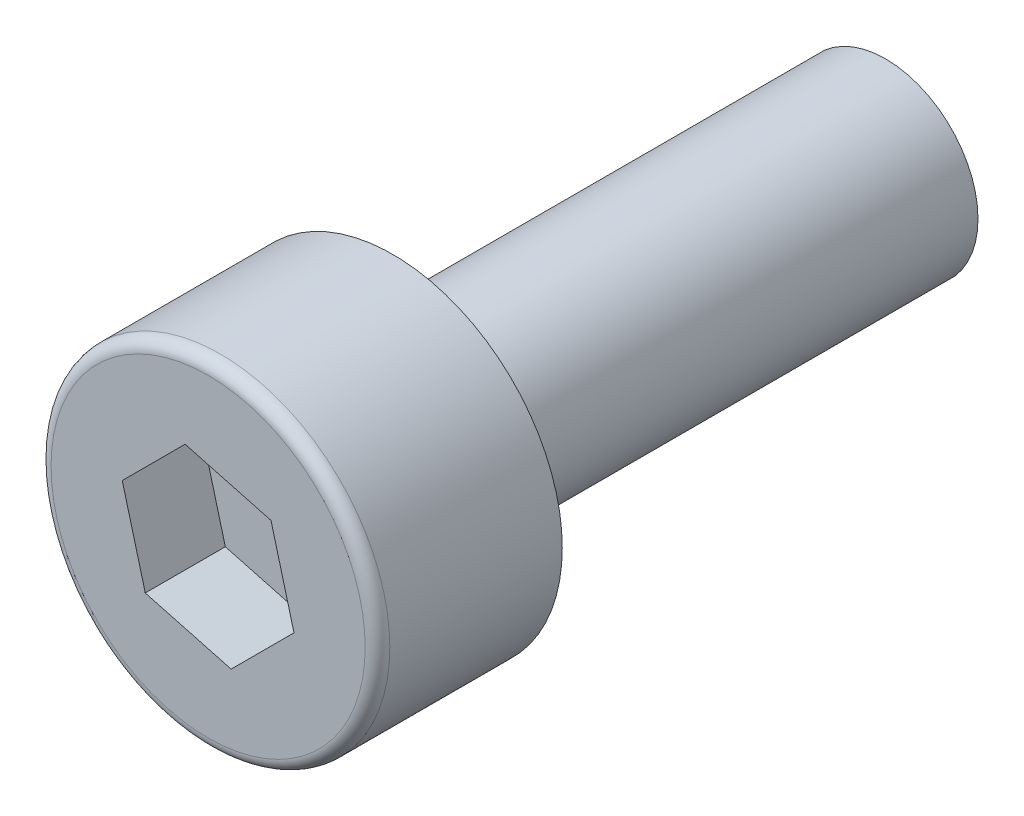
ISO-10303-21;
HEADER;
FILE_DESCRIPTION(('STEP AP214'),'2;1');
FILE_NAME('part.step','',(''),(''),'','','');
FILE_SCHEMA(('AUTOMOTIVE_DESIGN { 1 0 10303 214 1 1 1 1 }'));
ENDSEC;
DATA;
#1=APPLICATION_CONTEXT('core data for automotive mechanical design processes');
#2=APPLICATION_PROTOCOL_DEFINITION('international standard','automotive_design',2000,#1);
#3=PRODUCT_CONTEXT('',#1,'mechanical');
#4=PRODUCT('Part','Part','',(#3));
#5=PRODUCT_RELATED_PRODUCT_CATEGORY('part','',(#4));
#6=PRODUCT_DEFINITION_FORMATION('','',#4);
#7=PRODUCT_DEFINITION_CONTEXT('part definition',#1,'design');
#8=PRODUCT_DEFINITION('design','',#6,#7);
#9=PRODUCT_DEFINITION_SHAPE('','',#8);
#10=(LENGTH_UNIT() NAMED_UNIT(*) SI_UNIT(.MILLI.,.METRE.));
#11=(NAMED_UNIT(*) PLANE_ANGLE_UNIT() SI_UNIT($,.RADIAN.));
#12=(NAMED_UNIT(*) SI_UNIT($,.STERADIAN.) SOLID_ANGLE_UNIT());
#13=UNCERTAINTY_MEASURE_WITH_UNIT(LENGTH_MEASURE(1.E-05),#10,'distance_accuracy_value','');
#14=(GEOMETRIC_REPRESENTATION_CONTEXT(3) GLOBAL_UNCERTAINTY_ASSIGNED_CONTEXT((#13)) GLOBAL_UNIT_ASSIGNED_CONTEXT((#10,
#11,#12)) REPRESENTATION_CONTEXT('',''));
#15=CARTESIAN_POINT('',(0.,0.,0.));
#16=DIRECTION('',(0.,0.,1.));
#17=DIRECTION('',(1.,0.,0.));
#18=AXIS2_PLACEMENT_3D('',#15,#16,#17);
#19=CARTESIAN_POINT('',(0.,0.,0.));
#20=DIRECTION('',(0.,0.,1.));
#21=DIRECTION('',(1.,0.,0.));
#22=AXIS2_PLACEMENT_3D('',#19,#20,#21);
#23=PLANE('',#22);
#24=CARTESIAN_POINT('',(0.,0.,0.));
#25=DIRECTION('',(0.,0.,1.));
#26=DIRECTION('',(1.,0.,0.));
#27=AXIS2_PLACEMENT_3D('',#24,#25,#26);
#28=CIRCLE('',#27,2.75);
#29=CARTESIAN_POINT('',(2.75,0.,0.));
#30=VERTEX_POINT('',#29);
#31=EDGE_CURVE('E137',#30,#30,#28,.T.);
#32=ORIENTED_EDGE('',*,*,#31,.F.);
#33=EDGE_LOOP('',(#32));
#34=FACE_BOUND('',#33,.T.);
#35=CARTESIAN_POINT('',(0.,0.,0.));
#36=DIRECTION('',(0.,0.,1.));
#37=DIRECTION('',(1.,0.,0.));
#38=AXIS2_PLACEMENT_3D('',#35,#36,#37);
#39=CIRCLE('',#38,1.5);
#40=CARTESIAN_POINT('',(1.5,0.,0.));
#41=VERTEX_POINT('',#40);
#42=EDGE_CURVE('E145',#41,#41,#39,.F.);
#43=ORIENTED_EDGE('',*,*,#42,.F.);
#44=EDGE_LOOP('',(#43));
#45=FACE_BOUND('',#44,.T.);
#46=ADVANCED_FACE('F34',(#34,#45),#23,.F.);
#47=CARTESIAN_POINT('',(0.,0.,3.));
#48=DIRECTION('',(0.,0.,-1.));
#49=DIRECTION('',(-1.,0.,0.));
#50=AXIS2_PLACEMENT_3D('',#47,#48,#49);
#51=CYLINDRICAL_SURFACE('',#50,2.75);
#52=CARTESIAN_POINT('',(0.,0.,2.8));
#53=DIRECTION('',(0.,0.,1.));
#54=DIRECTION('',(1.,0.,0.));
#55=AXIS2_PLACEMENT_3D('',#52,#53,#54);
#56=CIRCLE('',#55,2.75);
#57=CARTESIAN_POINT('',(2.75,0.,2.8));
#58=VERTEX_POINT('',#57);
#59=EDGE_CURVE('E11',#58,#58,#56,.F.);
#60=ORIENTED_EDGE('',*,*,#59,.T.);
#61=EDGE_LOOP('',(#60));
#62=FACE_BOUND('',#61,.T.);
#63=ORIENTED_EDGE('',*,*,#31,.T.);
#64=EDGE_LOOP('',(#63));
#65=FACE_BOUND('',#64,.T.);
#66=ADVANCED_FACE('F164',(#62,#65),#51,.T.);
#67=CARTESIAN_POINT('',(0.,0.,3.));
#68=DIRECTION('',(0.,0.,1.));
#69=DIRECTION('',(1.,0.,0.));
#70=AXIS2_PLACEMENT_3D('',#67,#68,#69);
#71=PLANE('',#70);
#72=CARTESIAN_POINT('',(0.,0.,3.));
#73=DIRECTION('',(0.,0.,1.));
#74=DIRECTION('',(1.,0.,0.));
#75=AXIS2_PLACEMENT_3D('',#72,#73,#74);
#76=CIRCLE('',#75,2.55);
#77=CARTESIAN_POINT('',(2.55,0.,3.));
#78=VERTEX_POINT('',#77);
#79=EDGE_CURVE('E42',#78,#78,#76,.T.);
#80=ORIENTED_EDGE('',*,*,#79,.T.);
#81=EDGE_LOOP('',(#80));
#82=FACE_BOUND('',#81,.T.);
#83=DIRECTION('',(0.258819045102521,-0.965925826289068,0.));
#84=VECTOR('',#83,1.);
#85=CARTESIAN_POINT('',(-1.39419383956301,0.373573113403356,3.));
#86=LINE('',#85,#84);
#87=CARTESIAN_POINT('',(-1.39419383956301,0.373573113403356,3.));
#88=VERTEX_POINT('',#87);
#89=CARTESIAN_POINT('',(-1.02062072615966,-1.02062072615966,3.));
#90=VERTEX_POINT('',#89);
#91=EDGE_CURVE('E49',#88,#90,#86,.T.);
#92=ORIENTED_EDGE('',*,*,#91,.F.);
#93=DIRECTION('',(-0.707106781186548,-0.707106781186548,0.));
#94=VECTOR('',#93,1.);
#95=CARTESIAN_POINT('',(-0.373573113403355,1.39419383956301,3.));
#96=LINE('',#95,#94);
#97=CARTESIAN_POINT('',(-0.373573113403355,1.39419383956301,3.));
#98=VERTEX_POINT('',#97);
#99=EDGE_CURVE('E133',#98,#88,#96,.T.);
#100=ORIENTED_EDGE('',*,*,#99,.F.);
#101=DIRECTION('',(-0.965925826289068,0.258819045102521,0.));
#102=VECTOR('',#101,1.);
#103=CARTESIAN_POINT('',(1.02062072615966,1.02062072615966,3.));
#104=LINE('',#103,#102);
#105=CARTESIAN_POINT('',(1.02062072615966,1.02062072615966,3.));
#106=VERTEX_POINT('',#105);
#107=EDGE_CURVE('E131',#106,#98,#104,.T.);
#108=ORIENTED_EDGE('',*,*,#107,.F.);
#109=DIRECTION('',(-0.258819045102521,0.965925826289068,0.));
#110=VECTOR('',#109,1.);
#111=CARTESIAN_POINT('',(1.39419383956301,-0.373573113403355,3.));
#112=LINE('',#111,#110);
#113=CARTESIAN_POINT('',(1.39419383956301,-0.373573113403355,3.));
#114=VERTEX_POINT('',#113);
#115=EDGE_CURVE('E97',#114,#106,#112,.T.);
#116=ORIENTED_EDGE('',*,*,#115,.F.);
#117=DIRECTION('',(0.707106781186548,0.707106781186548,0.));
#118=VECTOR('',#117,1.);
#119=CARTESIAN_POINT('',(0.373573113403355,-1.39419383956301,3.));
#120=LINE('',#119,#118);
#121=CARTESIAN_POINT('',(0.373573113403355,-1.39419383956301,3.));
#122=VERTEX_POINT('',#121);
#123=EDGE_CURVE('E127',#122,#114,#120,.T.);
#124=ORIENTED_EDGE('',*,*,#123,.F.);
#125=DIRECTION('',(0.965925826289068,-0.258819045102521,0.));
#126=VECTOR('',#125,1.);
#127=CARTESIAN_POINT('',(-1.02062072615966,-1.02062072615966,3.));
#128=LINE('',#127,#126);
#129=EDGE_CURVE('E123',#90,#122,#128,.T.);
#130=ORIENTED_EDGE('',*,*,#129,.F.);
#131=EDGE_LOOP('',(#92,#100,#108,#116,#124,#130));
#132=FACE_BOUND('',#131,.T.);
#133=ADVANCED_FACE('F150',(#82,#132),#71,.T.);
#134=CARTESIAN_POINT('',(-1.39419383956301,0.373573113403356,1.7));
#135=DIRECTION('',(-0.965925826289068,-0.258819045102521,0.));
#136=DIRECTION('',(0.258819045102521,-0.965925826289068,0.));
#137=AXIS2_PLACEMENT_3D('',#134,#135,#136);
#138=PLANE('',#137);
#139=ORIENTED_EDGE('',*,*,#91,.T.);
#140=DIRECTION('',(0.,0.,1.));
#141=VECTOR('',#140,1.);
#142=CARTESIAN_POINT('',(-1.02062072615966,-1.02062072615966,1.7));
#143=LINE('',#142,#141);
#144=CARTESIAN_POINT('',(-1.02062072615966,-1.02062072615966,1.7));
#145=VERTEX_POINT('',#144);
#146=EDGE_CURVE('E79',#145,#90,#143,.T.);
#147=ORIENTED_EDGE('',*,*,#146,.F.);
#148=DIRECTION('',(0.258819045102521,-0.965925826289068,0.));
#149=VECTOR('',#148,1.);
#150=CARTESIAN_POINT('',(-1.39419383956301,0.373573113403356,1.7));
#151=LINE('',#150,#149);
#152=CARTESIAN_POINT('',(-1.39419383956301,0.373573113403356,1.7));
#153=VERTEX_POINT('',#152);
#154=EDGE_CURVE('E135',#153,#145,#151,.T.);
#155=ORIENTED_EDGE('',*,*,#154,.F.);
#156=DIRECTION('',(0.,0.,1.));
#157=VECTOR('',#156,1.);
#158=CARTESIAN_POINT('',(-1.39419383956301,0.373573113403356,1.7));
#159=LINE('',#158,#157);
#160=EDGE_CURVE('E57',#153,#88,#159,.T.);
#161=ORIENTED_EDGE('',*,*,#160,.T.);
#162=EDGE_LOOP('',(#139,#147,#155,#161));
#163=FACE_BOUND('',#162,.T.);
#164=ADVANCED_FACE('F176',(#163),#138,.F.);
#165=CARTESIAN_POINT('',(-0.373573113403355,1.39419383956301,1.7));
#166=DIRECTION('',(-0.707106781186548,0.707106781186548,0.));
#167=DIRECTION('',(-0.707106781186548,-0.707106781186548,0.));
#168=AXIS2_PLACEMENT_3D('',#165,#166,#167);
#169=PLANE('',#168);
#170=ORIENTED_EDGE('',*,*,#99,.T.);
#171=ORIENTED_EDGE('',*,*,#160,.F.);
#172=DIRECTION('',(-0.707106781186548,-0.707106781186548,0.));
#173=VECTOR('',#172,1.);
#174=CARTESIAN_POINT('',(-0.373573113403355,1.39419383956301,1.7));
#175=LINE('',#174,#173);
#176=CARTESIAN_POINT('',(-0.373573113403355,1.39419383956301,1.7));
#177=VERTEX_POINT('',#176);
#178=EDGE_CURVE('E109',#177,#153,#175,.T.);
#179=ORIENTED_EDGE('',*,*,#178,.F.);
#180=DIRECTION('',(0.,0.,1.));
#181=VECTOR('',#180,1.);
#182=CARTESIAN_POINT('',(-0.373573113403355,1.39419383956301,1.7));
#183=LINE('',#182,#181);
#184=EDGE_CURVE('E101',#177,#98,#183,.T.);
#185=ORIENTED_EDGE('',*,*,#184,.T.);
#186=EDGE_LOOP('',(#170,#171,#179,#185));
#187=FACE_BOUND('',#186,.T.);
#188=ADVANCED_FACE('F179',(#187),#169,.F.);
#189=CARTESIAN_POINT('',(1.02062072615966,1.02062072615966,1.7));
#190=DIRECTION('',(0.258819045102521,0.965925826289068,0.));
#191=DIRECTION('',(-0.965925826289068,0.258819045102521,0.));
#192=AXIS2_PLACEMENT_3D('',#189,#190,#191);
#193=PLANE('',#192);
#194=ORIENTED_EDGE('',*,*,#107,.T.);
#195=ORIENTED_EDGE('',*,*,#184,.F.);
#196=DIRECTION('',(-0.965925826289068,0.258819045102521,0.));
#197=VECTOR('',#196,1.);
#198=CARTESIAN_POINT('',(1.02062072615966,1.02062072615966,1.7));
#199=LINE('',#198,#197);
#200=CARTESIAN_POINT('',(1.02062072615966,1.02062072615966,1.7));
#201=VERTEX_POINT('',#200);
#202=EDGE_CURVE('E105',#201,#177,#199,.T.);
#203=ORIENTED_EDGE('',*,*,#202,.F.);
#204=DIRECTION('',(0.,0.,1.));
#205=VECTOR('',#204,1.);
#206=CARTESIAN_POINT('',(1.02062072615966,1.02062072615966,1.7));
#207=LINE('',#206,#205);
#208=EDGE_CURVE('E90',#201,#106,#207,.T.);
#209=ORIENTED_EDGE('',*,*,#208,.T.);
#210=EDGE_LOOP('',(#194,#195,#203,#209));
#211=FACE_BOUND('',#210,.T.);
#212=ADVANCED_FACE('F106',(#211),#193,.F.);
#213=CARTESIAN_POINT('',(1.39419383956301,-0.373573113403355,1.7));
#214=DIRECTION('',(0.965925826289068,0.258819045102521,0.));
#215=DIRECTION('',(-0.258819045102521,0.965925826289068,0.));
#216=AXIS2_PLACEMENT_3D('',#213,#214,#215);
#217=PLANE('',#216);
#218=ORIENTED_EDGE('',*,*,#115,.T.);
#219=ORIENTED_EDGE('',*,*,#208,.F.);
#220=DIRECTION('',(-0.258819045102521,0.965925826289068,0.));
#221=VECTOR('',#220,1.);
#222=CARTESIAN_POINT('',(1.39419383956301,-0.373573113403355,1.7));
#223=LINE('',#222,#221);
#224=CARTESIAN_POINT('',(1.39419383956301,-0.373573113403355,1.7));
#225=VERTEX_POINT('',#224);
#226=EDGE_CURVE('E94',#225,#201,#223,.T.);
#227=ORIENTED_EDGE('',*,*,#226,.F.);
#228=DIRECTION('',(0.,0.,1.));
#229=VECTOR('',#228,1.);
#230=CARTESIAN_POINT('',(1.39419383956301,-0.373573113403355,1.7));
#231=LINE('',#230,#229);
#232=EDGE_CURVE('E102',#225,#114,#231,.T.);
#233=ORIENTED_EDGE('',*,*,#232,.T.);
#234=EDGE_LOOP('',(#218,#219,#227,#233));
#235=FACE_BOUND('',#234,.T.);
#236=ADVANCED_FACE('F92',(#235),#217,.F.);
#237=CARTESIAN_POINT('',(0.373573113403355,-1.39419383956301,1.7));
#238=DIRECTION('',(0.707106781186548,-0.707106781186548,0.));
#239=DIRECTION('',(0.707106781186548,0.707106781186548,0.));
#240=AXIS2_PLACEMENT_3D('',#237,#238,#239);
#241=PLANE('',#240);
#242=ORIENTED_EDGE('',*,*,#123,.T.);
#243=ORIENTED_EDGE('',*,*,#232,.F.);
#244=DIRECTION('',(0.707106781186548,0.707106781186548,0.));
#245=VECTOR('',#244,1.);
#246=CARTESIAN_POINT('',(0.373573113403355,-1.39419383956301,1.7));
#247=LINE('',#246,#245);
#248=CARTESIAN_POINT('',(0.373573113403355,-1.39419383956301,1.7));
#249=VERTEX_POINT('',#248);
#250=EDGE_CURVE('E115',#249,#225,#247,.T.);
#251=ORIENTED_EDGE('',*,*,#250,.F.);
#252=DIRECTION('',(0.,0.,1.));
#253=VECTOR('',#252,1.);
#254=CARTESIAN_POINT('',(0.373573113403355,-1.39419383956301,1.7));
#255=LINE('',#254,#253);
#256=EDGE_CURVE('E140',#249,#122,#255,.T.);
#257=ORIENTED_EDGE('',*,*,#256,.T.);
#258=EDGE_LOOP('',(#242,#243,#251,#257));
#259=FACE_BOUND('',#258,.T.);
#260=ADVANCED_FACE('F183',(#259),#241,.F.);
#261=CARTESIAN_POINT('',(-1.02062072615966,-1.02062072615966,1.7));
#262=DIRECTION('',(-0.258819045102521,-0.965925826289068,0.));
#263=DIRECTION('',(0.965925826289068,-0.258819045102521,0.));
#264=AXIS2_PLACEMENT_3D('',#261,#262,#263);
#265=PLANE('',#264);
#266=ORIENTED_EDGE('',*,*,#129,.T.);
#267=ORIENTED_EDGE('',*,*,#256,.F.);
#268=DIRECTION('',(0.965925826289068,-0.258819045102521,0.));
#269=VECTOR('',#268,1.);
#270=CARTESIAN_POINT('',(-1.02062072615966,-1.02062072615966,1.7));
#271=LINE('',#270,#269);
#272=EDGE_CURVE('E117',#145,#249,#271,.T.);
#273=ORIENTED_EDGE('',*,*,#272,.F.);
#274=ORIENTED_EDGE('',*,*,#146,.T.);
#275=EDGE_LOOP('',(#266,#267,#273,#274));
#276=FACE_BOUND('',#275,.T.);
#277=ADVANCED_FACE('F180',(#276),#265,.F.);
#278=CARTESIAN_POINT('',(0.,0.,1.7));
#279=DIRECTION('',(0.,0.,1.));
#280=DIRECTION('',(1.,0.,0.));
#281=AXIS2_PLACEMENT_3D('',#278,#279,#280);
#282=PLANE('',#281);
#283=ORIENTED_EDGE('',*,*,#154,.T.);
#284=ORIENTED_EDGE('',*,*,#272,.T.);
#285=ORIENTED_EDGE('',*,*,#250,.T.);
#286=ORIENTED_EDGE('',*,*,#226,.T.);
#287=ORIENTED_EDGE('',*,*,#202,.T.);
#288=ORIENTED_EDGE('',*,*,#178,.T.);
#289=EDGE_LOOP('',(#283,#284,#285,#286,#287,#288));
#290=FACE_BOUND('',#289,.T.);
#291=ADVANCED_FACE('F112',(#290),#282,.T.);
#292=CARTESIAN_POINT('',(0.,0.,-8.));
#293=DIRECTION('',(0.,0.,1.));
#294=DIRECTION('',(1.,0.,0.));
#295=AXIS2_PLACEMENT_3D('',#292,#293,#294);
#296=CYLINDRICAL_SURFACE('',#295,1.5);
#297=CARTESIAN_POINT('',(0.,0.,-8.));
#298=DIRECTION('',(0.,0.,-1.));
#299=DIRECTION('',(-1.,0.,0.));
#300=AXIS2_PLACEMENT_3D('',#297,#298,#299);
#301=CIRCLE('',#300,1.5);
#302=CARTESIAN_POINT('',(-1.5,0.,-8.));
#303=VERTEX_POINT('',#302);
#304=EDGE_CURVE('E124',#303,#303,#301,.T.);
#305=ORIENTED_EDGE('',*,*,#304,.F.);
#306=EDGE_LOOP('',(#305));
#307=FACE_BOUND('',#306,.T.);
#308=ORIENTED_EDGE('',*,*,#42,.T.);
#309=EDGE_LOOP('',(#308));
#310=FACE_BOUND('',#309,.T.);
#311=ADVANCED_FACE('F159',(#307,#310),#296,.T.);
#312=CARTESIAN_POINT('',(0.,0.,-8.));
#313=DIRECTION('',(0.,0.,-1.));
#314=DIRECTION('',(-1.,0.,0.));
#315=AXIS2_PLACEMENT_3D('',#312,#313,#314);
#316=PLANE('',#315);
#317=ORIENTED_EDGE('',*,*,#304,.T.);
#318=EDGE_LOOP('',(#317));
#319=FACE_BOUND('',#318,.T.);
#320=ADVANCED_FACE('F154',(#319),#316,.T.);
#321=CARTESIAN_POINT('',(0.,0.,2.8));
#322=DIRECTION('',(0.,0.,1.));
#323=DIRECTION('',(1.,0.,0.));
#324=AXIS2_PLACEMENT_3D('',#321,#322,#323);
#325=TOROIDAL_SURFACE('',#324,2.55,0.2);
#326=ORIENTED_EDGE('',*,*,#59,.F.);
#327=EDGE_LOOP('',(#326));
#328=FACE_BOUND('',#327,.T.);
#329=ORIENTED_EDGE('',*,*,#79,.F.);
#330=EDGE_LOOP('',(#329));
#331=FACE_BOUND('',#330,.T.);
#332=ADVANCED_FACE('F36',(#328,#331),#325,.T.);
#333=CLOSED_SHELL('',(#46,#66,#133,#164,#188,#212,#236,#260,#277,#291,#311,#320,#332));
#334=MANIFOLD_SOLID_BREP('B2',#333);
#335=ADVANCED_BREP_SHAPE_REPRESENTATION('',(#18,#334),#14);
#336=SHAPE_DEFINITION_REPRESENTATION(#9,#335);
ENDSEC;
END-ISO-10303-21;
